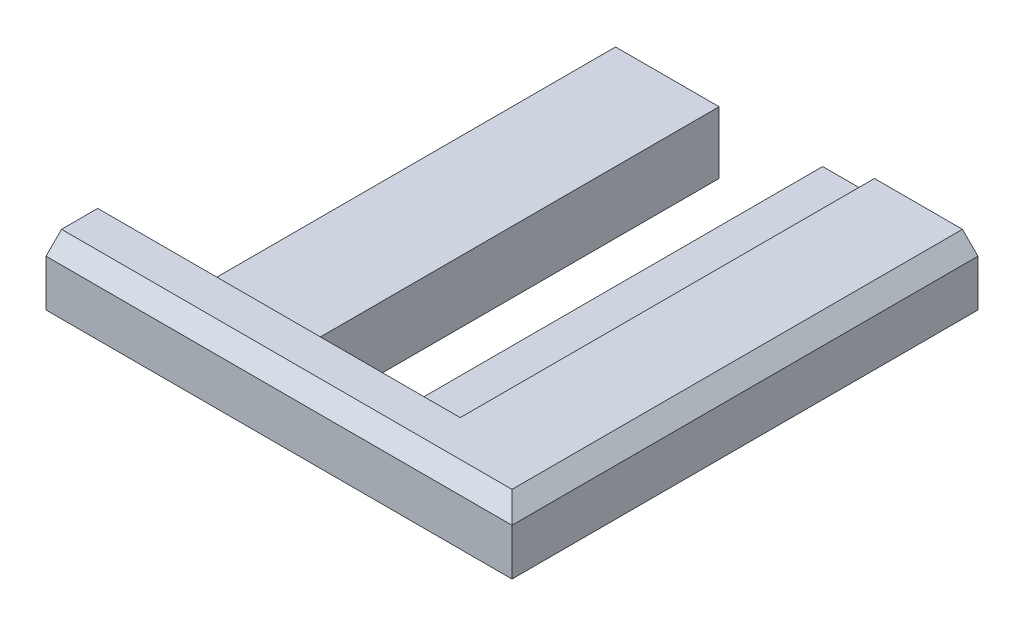
ISO-10303-21;
HEADER;
FILE_DESCRIPTION(('STEP AP214'),'2;1');
FILE_NAME('part.step','',(''),(''),'','','');
FILE_SCHEMA(('AUTOMOTIVE_DESIGN { 1 0 10303 214 1 1 1 1 }'));
ENDSEC;
DATA;
#1=APPLICATION_CONTEXT('core data for automotive mechanical design processes');
#2=APPLICATION_PROTOCOL_DEFINITION('international standard','automotive_design',2000,#1);
#3=PRODUCT_CONTEXT('',#1,'mechanical');
#4=PRODUCT('Part','Part','',(#3));
#5=PRODUCT_RELATED_PRODUCT_CATEGORY('part','',(#4));
#6=PRODUCT_DEFINITION_FORMATION('','',#4);
#7=PRODUCT_DEFINITION_CONTEXT('part definition',#1,'design');
#8=PRODUCT_DEFINITION('design','',#6,#7);
#9=PRODUCT_DEFINITION_SHAPE('','',#8);
#10=(LENGTH_UNIT() NAMED_UNIT(*) SI_UNIT(.MILLI.,.METRE.));
#11=(NAMED_UNIT(*) PLANE_ANGLE_UNIT() SI_UNIT($,.RADIAN.));
#12=(NAMED_UNIT(*) SI_UNIT($,.STERADIAN.) SOLID_ANGLE_UNIT());
#13=UNCERTAINTY_MEASURE_WITH_UNIT(LENGTH_MEASURE(1.E-05),#10,'distance_accuracy_value','');
#14=(GEOMETRIC_REPRESENTATION_CONTEXT(3) GLOBAL_UNCERTAINTY_ASSIGNED_CONTEXT((#13)) GLOBAL_UNIT_ASSIGNED_CONTEXT((#10,
#11,#12)) REPRESENTATION_CONTEXT('',''));
#15=CARTESIAN_POINT('',(0.,0.,0.));
#16=DIRECTION('',(0.,0.,1.));
#17=DIRECTION('',(1.,0.,0.));
#18=AXIS2_PLACEMENT_3D('',#15,#16,#17);
#19=CARTESIAN_POINT('',(0.,38.1,-228.6));
#20=DIRECTION('',(0.,0.,1.));
#21=DIRECTION('',(1.,0.,0.));
#22=AXIS2_PLACEMENT_3D('',#19,#20,#21);
#23=PLANE('',#22);
#24=CARTESIAN_POINT('',(-12.6848921789995,19.05,-228.6));
#25=DIRECTION('',(0.,0.,-1.));
#26=DIRECTION('',(-1.,0.,0.));
#27=AXIS2_PLACEMENT_3D('',#24,#25,#26);
#28=CIRCLE('',#27,9.525);
#29=CARTESIAN_POINT('',(-22.2098921789995,19.05,-228.6));
#30=VERTEX_POINT('',#29);
#31=EDGE_CURVE('E201',#30,#30,#28,.T.);
#32=ORIENTED_EDGE('',*,*,#31,.F.);
#33=EDGE_LOOP('',(#32));
#34=FACE_BOUND('',#33,.T.);
#35=DIRECTION('',(0.,-1.,0.));
#36=VECTOR('',#35,1.);
#37=CARTESIAN_POINT('',(0.,38.1,-228.6));
#38=LINE('',#37,#36);
#39=CARTESIAN_POINT('',(0.,30.48,-228.6));
#40=VERTEX_POINT('',#39);
#41=CARTESIAN_POINT('',(0.,7.62000000000002,-228.6));
#42=VERTEX_POINT('',#41);
#43=EDGE_CURVE('E219',#40,#42,#38,.T.);
#44=ORIENTED_EDGE('',*,*,#43,.T.);
#45=DIRECTION('',(0.707106781186549,0.707106781186546,0.));
#46=VECTOR('',#45,1.);
#47=CARTESIAN_POINT('',(0.,7.61999999999999,-228.6));
#48=LINE('',#47,#46);
#49=CARTESIAN_POINT('',(-7.62000000000004,0.,-228.6));
#50=VERTEX_POINT('',#49);
#51=EDGE_CURVE('E284',#42,#50,#48,.F.);
#52=ORIENTED_EDGE('',*,*,#51,.T.);
#53=DIRECTION('',(-1.,0.,0.));
#54=VECTOR('',#53,1.);
#55=CARTESIAN_POINT('',(0.,0.,-228.6));
#56=LINE('',#55,#54);
#57=CARTESIAN_POINT('',(-76.2,0.,-228.6));
#58=VERTEX_POINT('',#57);
#59=EDGE_CURVE('E211',#50,#58,#56,.T.);
#60=ORIENTED_EDGE('',*,*,#59,.T.);
#61=DIRECTION('',(0.,-1.,0.));
#62=VECTOR('',#61,1.);
#63=CARTESIAN_POINT('',(-76.2,38.1,-228.6));
#64=LINE('',#63,#62);
#65=CARTESIAN_POINT('',(-76.2,30.48,-228.6));
#66=VERTEX_POINT('',#65);
#67=EDGE_CURVE('E259',#66,#58,#64,.T.);
#68=ORIENTED_EDGE('',*,*,#67,.F.);
#69=DIRECTION('',(1.,0.,0.));
#70=VECTOR('',#69,1.);
#71=CARTESIAN_POINT('',(0.,30.48,-228.6));
#72=LINE('',#71,#70);
#73=CARTESIAN_POINT('',(-50.8,30.48,-228.6));
#74=VERTEX_POINT('',#73);
#75=EDGE_CURVE('E199',#66,#74,#72,.T.);
#76=ORIENTED_EDGE('',*,*,#75,.T.);
#77=DIRECTION('',(0.,1.,0.));
#78=VECTOR('',#77,1.);
#79=CARTESIAN_POINT('',(-50.8,38.1,-228.6));
#80=LINE('',#79,#78);
#81=CARTESIAN_POINT('',(-50.8,38.1,-228.6));
#82=VERTEX_POINT('',#81);
#83=EDGE_CURVE('E176',#74,#82,#80,.T.);
#84=ORIENTED_EDGE('',*,*,#83,.T.);
#85=DIRECTION('',(-1.,0.,0.));
#86=VECTOR('',#85,1.);
#87=CARTESIAN_POINT('',(0.,38.1,-228.6));
#88=LINE('',#87,#86);
#89=CARTESIAN_POINT('',(-7.61999999999996,38.1,-228.6));
#90=VERTEX_POINT('',#89);
#91=EDGE_CURVE('E214',#90,#82,#88,.T.);
#92=ORIENTED_EDGE('',*,*,#91,.F.);
#93=DIRECTION('',(0.707106781186545,-0.70710678118655,0.));
#94=VECTOR('',#93,1.);
#95=CARTESIAN_POINT('',(-7.61999999999999,38.1,-228.6));
#96=LINE('',#95,#94);
#97=EDGE_CURVE('E282',#90,#40,#96,.T.);
#98=ORIENTED_EDGE('',*,*,#97,.T.);
#99=EDGE_LOOP('',(#44,#52,#60,#68,#76,#84,#92,#98));
#100=FACE_BOUND('',#99,.T.);
#101=ADVANCED_FACE('F39',(#34,#100),#23,.F.);
#102=CARTESIAN_POINT('',(-76.2,38.1,0.));
#103=DIRECTION('',(-1.,0.,0.));
#104=DIRECTION('',(0.,0.,1.));
#105=AXIS2_PLACEMENT_3D('',#102,#103,#104);
#106=PLANE('',#105);
#107=DIRECTION('',(0.,0.,1.));
#108=VECTOR('',#107,1.);
#109=CARTESIAN_POINT('',(-76.2,30.48,0.));
#110=LINE('',#109,#108);
#111=CARTESIAN_POINT('',(-76.2,30.48,-25.4));
#112=VERTEX_POINT('',#111);
#113=EDGE_CURVE('E197',#66,#112,#110,.T.);
#114=ORIENTED_EDGE('',*,*,#113,.F.);
#115=ORIENTED_EDGE('',*,*,#67,.T.);
#116=DIRECTION('',(0.,0.,-1.));
#117=VECTOR('',#116,1.);
#118=CARTESIAN_POINT('',(-76.2,0.,0.));
#119=LINE('',#118,#117);
#120=CARTESIAN_POINT('',(-76.2,0.,-25.4));
#121=VERTEX_POINT('',#120);
#122=EDGE_CURVE('E221',#121,#58,#119,.T.);
#123=ORIENTED_EDGE('',*,*,#122,.F.);
#124=DIRECTION('',(0.,-1.,0.));
#125=VECTOR('',#124,1.);
#126=CARTESIAN_POINT('',(-76.2,38.1,-25.4));
#127=LINE('',#126,#125);
#128=EDGE_CURVE('E257',#112,#121,#127,.T.);
#129=ORIENTED_EDGE('',*,*,#128,.F.);
#130=EDGE_LOOP('',(#114,#115,#123,#129));
#131=FACE_BOUND('',#130,.T.);
#132=ADVANCED_FACE('F319',(#131),#106,.T.);
#133=CARTESIAN_POINT('',(0.,38.1,-25.4));
#134=DIRECTION('',(0.,0.,1.));
#135=DIRECTION('',(1.,0.,0.));
#136=AXIS2_PLACEMENT_3D('',#133,#134,#135);
#137=PLANE('',#136);
#138=DIRECTION('',(0.,-1.,0.));
#139=VECTOR('',#138,1.);
#140=CARTESIAN_POINT('',(-127.,38.1,-25.4));
#141=LINE('',#140,#139);
#142=CARTESIAN_POINT('',(-127.,30.48,-25.4));
#143=VERTEX_POINT('',#142);
#144=CARTESIAN_POINT('',(-127.,0.,-25.4));
#145=VERTEX_POINT('',#144);
#146=EDGE_CURVE('E255',#143,#145,#141,.T.);
#147=ORIENTED_EDGE('',*,*,#146,.F.);
#148=DIRECTION('',(1.,0.,0.));
#149=VECTOR('',#148,1.);
#150=CARTESIAN_POINT('',(0.,30.48,-25.4));
#151=LINE('',#150,#149);
#152=EDGE_CURVE('E194',#143,#112,#151,.T.);
#153=ORIENTED_EDGE('',*,*,#152,.T.);
#154=ORIENTED_EDGE('',*,*,#128,.T.);
#155=DIRECTION('',(-1.,0.,0.));
#156=VECTOR('',#155,1.);
#157=CARTESIAN_POINT('',(0.,0.,-25.4));
#158=LINE('',#157,#156);
#159=EDGE_CURVE('E224',#121,#145,#158,.T.);
#160=ORIENTED_EDGE('',*,*,#159,.T.);
#161=EDGE_LOOP('',(#147,#153,#154,#160));
#162=FACE_BOUND('',#161,.T.);
#163=ADVANCED_FACE('F322',(#162),#137,.F.);
#164=CARTESIAN_POINT('',(-127.,38.1,0.));
#165=DIRECTION('',(-1.,0.,0.));
#166=DIRECTION('',(0.,0.,1.));
#167=AXIS2_PLACEMENT_3D('',#164,#165,#166);
#168=PLANE('',#167);
#169=DIRECTION('',(0.,-1.,0.));
#170=VECTOR('',#169,1.);
#171=CARTESIAN_POINT('',(-127.,38.1,-228.6));
#172=LINE('',#171,#170);
#173=CARTESIAN_POINT('',(-127.,30.48,-228.6));
#174=VERTEX_POINT('',#173);
#175=CARTESIAN_POINT('',(-127.,0.,-228.6));
#176=VERTEX_POINT('',#175);
#177=EDGE_CURVE('E253',#174,#176,#172,.T.);
#178=ORIENTED_EDGE('',*,*,#177,.F.);
#179=DIRECTION('',(0.,0.,1.));
#180=VECTOR('',#179,1.);
#181=CARTESIAN_POINT('',(-127.,30.48,0.));
#182=LINE('',#181,#180);
#183=EDGE_CURVE('E191',#174,#143,#182,.T.);
#184=ORIENTED_EDGE('',*,*,#183,.T.);
#185=ORIENTED_EDGE('',*,*,#146,.T.);
#186=DIRECTION('',(0.,0.,-1.));
#187=VECTOR('',#186,1.);
#188=CARTESIAN_POINT('',(-127.,0.,0.));
#189=LINE('',#188,#187);
#190=EDGE_CURVE('E227',#145,#176,#189,.T.);
#191=ORIENTED_EDGE('',*,*,#190,.T.);
#192=EDGE_LOOP('',(#178,#184,#185,#191));
#193=FACE_BOUND('',#192,.T.);
#194=ADVANCED_FACE('F325',(#193),#168,.F.);
#195=CARTESIAN_POINT('',(0.,38.1,-228.6));
#196=DIRECTION('',(0.,0.,1.));
#197=DIRECTION('',(1.,0.,0.));
#198=AXIS2_PLACEMENT_3D('',#195,#196,#197);
#199=PLANE('',#198);
#200=DIRECTION('',(0.,-1.,0.));
#201=VECTOR('',#200,1.);
#202=CARTESIAN_POINT('',(-177.8,38.1,-228.6));
#203=LINE('',#202,#201);
#204=CARTESIAN_POINT('',(-177.8,30.48,-228.6));
#205=VERTEX_POINT('',#204);
#206=CARTESIAN_POINT('',(-177.8,0.,-228.6));
#207=VERTEX_POINT('',#206);
#208=EDGE_CURVE('E251',#205,#207,#203,.T.);
#209=ORIENTED_EDGE('',*,*,#208,.F.);
#210=DIRECTION('',(1.,0.,0.));
#211=VECTOR('',#210,1.);
#212=CARTESIAN_POINT('',(0.,30.48,-228.6));
#213=LINE('',#212,#211);
#214=EDGE_CURVE('E188',#205,#174,#213,.T.);
#215=ORIENTED_EDGE('',*,*,#214,.T.);
#216=ORIENTED_EDGE('',*,*,#177,.T.);
#217=DIRECTION('',(-1.,0.,0.));
#218=VECTOR('',#217,1.);
#219=CARTESIAN_POINT('',(0.,0.,-228.6));
#220=LINE('',#219,#218);
#221=EDGE_CURVE('E231',#176,#207,#220,.T.);
#222=ORIENTED_EDGE('',*,*,#221,.T.);
#223=EDGE_LOOP('',(#209,#215,#216,#222));
#224=FACE_BOUND('',#223,.T.);
#225=ADVANCED_FACE('F330',(#224),#199,.F.);
#226=CARTESIAN_POINT('',(-177.8,38.1,0.));
#227=DIRECTION('',(-1.,0.,0.));
#228=DIRECTION('',(0.,0.,1.));
#229=AXIS2_PLACEMENT_3D('',#226,#227,#228);
#230=PLANE('',#229);
#231=DIRECTION('',(0.,0.,1.));
#232=VECTOR('',#231,1.);
#233=CARTESIAN_POINT('',(-177.8,30.48,0.));
#234=LINE('',#233,#232);
#235=CARTESIAN_POINT('',(-177.8,30.48,-25.4));
#236=VERTEX_POINT('',#235);
#237=EDGE_CURVE('E186',#205,#236,#234,.T.);
#238=ORIENTED_EDGE('',*,*,#237,.F.);
#239=ORIENTED_EDGE('',*,*,#208,.T.);
#240=DIRECTION('',(0.,0.,-1.));
#241=VECTOR('',#240,1.);
#242=CARTESIAN_POINT('',(-177.8,0.,0.));
#243=LINE('',#242,#241);
#244=CARTESIAN_POINT('',(-177.8,0.,-25.4));
#245=VERTEX_POINT('',#244);
#246=EDGE_CURVE('E234',#245,#207,#243,.T.);
#247=ORIENTED_EDGE('',*,*,#246,.F.);
#248=DIRECTION('',(0.,-1.,0.));
#249=VECTOR('',#248,1.);
#250=CARTESIAN_POINT('',(-177.8,38.1,-25.4));
#251=LINE('',#250,#249);
#252=EDGE_CURVE('E249',#236,#245,#251,.T.);
#253=ORIENTED_EDGE('',*,*,#252,.F.);
#254=EDGE_LOOP('',(#238,#239,#247,#253));
#255=FACE_BOUND('',#254,.T.);
#256=ADVANCED_FACE('F333',(#255),#230,.T.);
#257=DIRECTION('',(0.,-1.,0.));
#258=VECTOR('',#257,1.);
#259=CARTESIAN_POINT('',(-228.6,38.1,-25.4));
#260=LINE('',#259,#258);
#261=CARTESIAN_POINT('',(-228.6,30.48,-25.4));
#262=VERTEX_POINT('',#261);
#263=CARTESIAN_POINT('',(-228.6,0.,-25.4));
#264=VERTEX_POINT('',#263);
#265=EDGE_CURVE('E246',#262,#264,#260,.T.);
#266=ORIENTED_EDGE('',*,*,#265,.F.);
#267=DIRECTION('',(1.,0.,0.));
#268=VECTOR('',#267,1.);
#269=CARTESIAN_POINT('',(0.,30.48,-25.4));
#270=LINE('',#269,#268);
#271=EDGE_CURVE('E183',#262,#236,#270,.T.);
#272=ORIENTED_EDGE('',*,*,#271,.T.);
#273=ORIENTED_EDGE('',*,*,#252,.T.);
#274=EDGE_CURVE('E228',#245,#264,#158,.T.);
#275=ORIENTED_EDGE('',*,*,#274,.T.);
#276=EDGE_LOOP('',(#266,#272,#273,#275));
#277=FACE_BOUND('',#276,.T.);
#278=ADVANCED_FACE('F337',(#277),#137,.F.);
#279=CARTESIAN_POINT('',(-228.6,38.1,0.));
#280=DIRECTION('',(-1.,0.,0.));
#281=DIRECTION('',(0.,0.,1.));
#282=AXIS2_PLACEMENT_3D('',#279,#280,#281);
#283=PLANE('',#282);
#284=DIRECTION('',(0.,0.,-1.));
#285=VECTOR('',#284,1.);
#286=CARTESIAN_POINT('',(-228.6,0.,0.));
#287=LINE('',#286,#285);
#288=CARTESIAN_POINT('',(-228.6,0.,-7.62000000000004));
#289=VERTEX_POINT('',#288);
#290=EDGE_CURVE('E217',#289,#264,#287,.T.);
#291=ORIENTED_EDGE('',*,*,#290,.F.);
#292=DIRECTION('',(0.,0.707106781186546,0.707106781186549));
#293=VECTOR('',#292,1.);
#294=CARTESIAN_POINT('',(-228.6,22.86,15.24));
#295=LINE('',#294,#293);
#296=CARTESIAN_POINT('',(-228.6,7.62000000000002,0.));
#297=VERTEX_POINT('',#296);
#298=EDGE_CURVE('E271',#289,#297,#295,.T.);
#299=ORIENTED_EDGE('',*,*,#298,.T.);
#300=DIRECTION('',(0.,-1.,0.));
#301=VECTOR('',#300,1.);
#302=CARTESIAN_POINT('',(-228.6,38.1,0.));
#303=LINE('',#302,#301);
#304=CARTESIAN_POINT('',(-228.6,30.48,0.));
#305=VERTEX_POINT('',#304);
#306=EDGE_CURVE('E243',#305,#297,#303,.T.);
#307=ORIENTED_EDGE('',*,*,#306,.F.);
#308=DIRECTION('',(0.,-0.70710678118655,0.707106781186545));
#309=VECTOR('',#308,1.);
#310=CARTESIAN_POINT('',(-228.6,34.29,-3.81000000000001));
#311=LINE('',#310,#309);
#312=CARTESIAN_POINT('',(-228.6,38.1,-7.61999999999996));
#313=VERTEX_POINT('',#312);
#314=EDGE_CURVE('E269',#305,#313,#311,.F.);
#315=ORIENTED_EDGE('',*,*,#314,.T.);
#316=DIRECTION('',(0.,0.,-1.));
#317=VECTOR('',#316,1.);
#318=CARTESIAN_POINT('',(-228.6,38.1,0.));
#319=LINE('',#318,#317);
#320=CARTESIAN_POINT('',(-228.6,38.1,-25.3774669977022));
#321=VERTEX_POINT('',#320);
#322=EDGE_CURVE('E216',#313,#321,#319,.T.);
#323=ORIENTED_EDGE('',*,*,#322,.T.);
#324=DIRECTION('',(0.,1.,0.));
#325=VECTOR('',#324,1.);
#326=CARTESIAN_POINT('',(-228.6,38.1,-25.3774669977022));
#327=LINE('',#326,#325);
#328=CARTESIAN_POINT('',(-228.6,30.48,-25.3774669977022));
#329=VERTEX_POINT('',#328);
#330=EDGE_CURVE('E172',#329,#321,#327,.T.);
#331=ORIENTED_EDGE('',*,*,#330,.F.);
#332=DIRECTION('',(0.,0.,1.));
#333=VECTOR('',#332,1.);
#334=CARTESIAN_POINT('',(-228.6,30.48,0.));
#335=LINE('',#334,#333);
#336=EDGE_CURVE('E158',#262,#329,#335,.T.);
#337=ORIENTED_EDGE('',*,*,#336,.F.);
#338=ORIENTED_EDGE('',*,*,#265,.T.);
#339=EDGE_LOOP('',(#291,#299,#307,#315,#323,#331,#337,#338));
#340=FACE_BOUND('',#339,.T.);
#341=CARTESIAN_POINT('',(-228.6,19.05,-12.7));
#342=DIRECTION('',(-1.,0.,0.));
#343=DIRECTION('',(0.,0.,1.));
#344=AXIS2_PLACEMENT_3D('',#341,#342,#343);
#345=CIRCLE('',#344,9.525);
#346=CARTESIAN_POINT('',(-228.6,19.05,-3.175));
#347=VERTEX_POINT('',#346);
#348=EDGE_CURVE('E205',#347,#347,#345,.T.);
#349=ORIENTED_EDGE('',*,*,#348,.F.);
#350=EDGE_LOOP('',(#349));
#351=FACE_BOUND('',#350,.T.);
#352=ADVANCED_FACE('F342',(#340,#351),#283,.T.);
#353=CARTESIAN_POINT('',(0.,38.1,0.));
#354=DIRECTION('',(0.,0.,1.));
#355=DIRECTION('',(1.,0.,0.));
#356=AXIS2_PLACEMENT_3D('',#353,#354,#355);
#357=PLANE('',#356);
#358=ORIENTED_EDGE('',*,*,#306,.T.);
#359=DIRECTION('',(1.,0.,0.));
#360=VECTOR('',#359,1.);
#361=CARTESIAN_POINT('',(0.,7.62000000000002,0.));
#362=LINE('',#361,#360);
#363=CARTESIAN_POINT('',(0.,7.62000000000002,0.));
#364=VERTEX_POINT('',#363);
#365=EDGE_CURVE('E276',#297,#364,#362,.T.);
#366=ORIENTED_EDGE('',*,*,#365,.T.);
#367=DIRECTION('',(0.,-1.,0.));
#368=VECTOR('',#367,1.);
#369=CARTESIAN_POINT('',(0.,38.1,0.));
#370=LINE('',#369,#368);
#371=CARTESIAN_POINT('',(0.,30.48,0.));
#372=VERTEX_POINT('',#371);
#373=EDGE_CURVE('E240',#372,#364,#370,.T.);
#374=ORIENTED_EDGE('',*,*,#373,.F.);
#375=DIRECTION('',(-1.,0.,0.));
#376=VECTOR('',#375,1.);
#377=CARTESIAN_POINT('',(0.,30.48,0.));
#378=LINE('',#377,#376);
#379=EDGE_CURVE('E273',#372,#305,#378,.T.);
#380=ORIENTED_EDGE('',*,*,#379,.T.);
#381=EDGE_LOOP('',(#358,#366,#374,#380));
#382=FACE_BOUND('',#381,.T.);
#383=ADVANCED_FACE('F353',(#382),#357,.T.);
#384=CARTESIAN_POINT('',(0.,38.1,0.));
#385=DIRECTION('',(-1.,0.,0.));
#386=DIRECTION('',(0.,0.,1.));
#387=AXIS2_PLACEMENT_3D('',#384,#385,#386);
#388=PLANE('',#387);
#389=ORIENTED_EDGE('',*,*,#373,.T.);
#390=DIRECTION('',(0.,0.,-1.));
#391=VECTOR('',#390,1.);
#392=CARTESIAN_POINT('',(0.,7.62000000000002,0.));
#393=LINE('',#392,#391);
#394=EDGE_CURVE('E280',#364,#42,#393,.T.);
#395=ORIENTED_EDGE('',*,*,#394,.T.);
#396=ORIENTED_EDGE('',*,*,#43,.F.);
#397=DIRECTION('',(0.,0.,1.));
#398=VECTOR('',#397,1.);
#399=CARTESIAN_POINT('',(0.,30.48,0.));
#400=LINE('',#399,#398);
#401=EDGE_CURVE('E278',#40,#372,#400,.T.);
#402=ORIENTED_EDGE('',*,*,#401,.T.);
#403=EDGE_LOOP('',(#389,#395,#396,#402));
#404=FACE_BOUND('',#403,.T.);
#405=ADVANCED_FACE('F303',(#404),#388,.F.);
#406=CARTESIAN_POINT('',(0.,38.1,0.));
#407=DIRECTION('',(0.,1.,0.));
#408=DIRECTION('',(0.,0.,1.));
#409=AXIS2_PLACEMENT_3D('',#406,#407,#408);
#410=PLANE('',#409);
#411=ORIENTED_EDGE('',*,*,#322,.F.);
#412=DIRECTION('',(1.,0.,0.));
#413=VECTOR('',#412,1.);
#414=CARTESIAN_POINT('',(0.,38.1,-7.61999999999996));
#415=LINE('',#414,#413);
#416=CARTESIAN_POINT('',(-7.61999999999996,38.1,-7.61999999999996));
#417=VERTEX_POINT('',#416);
#418=EDGE_CURVE('E11',#313,#417,#415,.T.);
#419=ORIENTED_EDGE('',*,*,#418,.T.);
#420=DIRECTION('',(0.,0.,-1.));
#421=VECTOR('',#420,1.);
#422=CARTESIAN_POINT('',(-7.61999999999996,38.1,-228.6));
#423=LINE('',#422,#421);
#424=EDGE_CURVE('E49',#417,#90,#423,.T.);
#425=ORIENTED_EDGE('',*,*,#424,.T.);
#426=ORIENTED_EDGE('',*,*,#91,.T.);
#427=DIRECTION('',(0.,0.,-1.));
#428=VECTOR('',#427,1.);
#429=CARTESIAN_POINT('',(-50.8,38.1,-25.4));
#430=LINE('',#429,#428);
#431=CARTESIAN_POINT('',(-50.8,38.1,-25.4));
#432=VERTEX_POINT('',#431);
#433=EDGE_CURVE('E162',#432,#82,#430,.T.);
#434=ORIENTED_EDGE('',*,*,#433,.F.);
#435=DIRECTION('',(0.999999991969463,0.,-0.000126732295370555));
#436=VECTOR('',#435,1.);
#437=CARTESIAN_POINT('',(-0.00321981617915604,38.1,-25.4064375926018));
#438=LINE('',#437,#436);
#439=EDGE_CURVE('E168',#321,#432,#438,.T.);
#440=ORIENTED_EDGE('',*,*,#439,.F.);
#441=EDGE_LOOP('',(#411,#419,#425,#426,#434,#440));
#442=FACE_BOUND('',#441,.T.);
#443=ADVANCED_FACE('F344',(#442),#410,.T.);
#444=CARTESIAN_POINT('',(0.,0.,0.));
#445=DIRECTION('',(0.,1.,0.));
#446=DIRECTION('',(0.,0.,1.));
#447=AXIS2_PLACEMENT_3D('',#444,#445,#446);
#448=PLANE('',#447);
#449=DIRECTION('',(0.,0.,1.));
#450=VECTOR('',#449,1.);
#451=CARTESIAN_POINT('',(-7.62000000000004,0.,0.));
#452=LINE('',#451,#450);
#453=CARTESIAN_POINT('',(-7.62000000000004,0.,-7.62000000000004));
#454=VERTEX_POINT('',#453);
#455=EDGE_CURVE('E264',#50,#454,#452,.T.);
#456=ORIENTED_EDGE('',*,*,#455,.T.);
#457=DIRECTION('',(-1.,0.,0.));
#458=VECTOR('',#457,1.);
#459=CARTESIAN_POINT('',(-228.6,0.,-7.62000000000004));
#460=LINE('',#459,#458);
#461=EDGE_CURVE('E266',#454,#289,#460,.T.);
#462=ORIENTED_EDGE('',*,*,#461,.T.);
#463=ORIENTED_EDGE('',*,*,#290,.T.);
#464=ORIENTED_EDGE('',*,*,#274,.F.);
#465=ORIENTED_EDGE('',*,*,#246,.T.);
#466=ORIENTED_EDGE('',*,*,#221,.F.);
#467=ORIENTED_EDGE('',*,*,#190,.F.);
#468=ORIENTED_EDGE('',*,*,#159,.F.);
#469=ORIENTED_EDGE('',*,*,#122,.T.);
#470=ORIENTED_EDGE('',*,*,#59,.F.);
#471=EDGE_LOOP('',(#456,#462,#463,#464,#465,#466,#467,#468,#469,#470));
#472=FACE_BOUND('',#471,.T.);
#473=ADVANCED_FACE('F312',(#472),#448,.F.);
#474=CARTESIAN_POINT('',(-190.5,19.05,-12.7));
#475=DIRECTION('',(-1.,0.,0.));
#476=DIRECTION('',(0.,0.,1.));
#477=AXIS2_PLACEMENT_3D('',#474,#475,#476);
#478=CYLINDRICAL_SURFACE('',#477,9.525);
#479=CARTESIAN_POINT('',(-190.5,19.05,-12.7));
#480=DIRECTION('',(-1.,0.,0.));
#481=DIRECTION('',(0.,0.,1.));
#482=AXIS2_PLACEMENT_3D('',#479,#480,#481);
#483=CIRCLE('',#482,9.525);
#484=CARTESIAN_POINT('',(-190.5,19.05,-3.175));
#485=VERTEX_POINT('',#484);
#486=EDGE_CURVE('E208',#485,#485,#483,.T.);
#487=CARTESIAN_POINT('',(-190.5,19.05,-3.175));
#488=CARTESIAN_POINT('',(-190.896875,19.05,-3.175));
#489=CARTESIAN_POINT('',(-191.29375,19.05,-3.175));
#490=CARTESIAN_POINT('',(-192.0875,19.05,-3.175));
#491=CARTESIAN_POINT('',(-192.484375,19.05,-3.175));
#492=CARTESIAN_POINT('',(-193.278125,19.05,-3.175));
#493=CARTESIAN_POINT('',(-193.675,19.05,-3.175));
#494=CARTESIAN_POINT('',(-194.46875,19.05,-3.175));
#495=CARTESIAN_POINT('',(-194.865625,19.05,-3.175));
#496=CARTESIAN_POINT('',(-195.659375,19.05,-3.175));
#497=CARTESIAN_POINT('',(-196.05625,19.05,-3.175));
#498=CARTESIAN_POINT('',(-196.85,19.05,-3.175));
#499=CARTESIAN_POINT('',(-197.246875,19.05,-3.175));
#500=CARTESIAN_POINT('',(-198.040625,19.05,-3.175));
#501=CARTESIAN_POINT('',(-198.4375,19.05,-3.175));
#502=CARTESIAN_POINT('',(-199.23125,19.05,-3.175));
#503=CARTESIAN_POINT('',(-199.628125,19.05,-3.175));
#504=CARTESIAN_POINT('',(-200.421875,19.05,-3.175));
#505=CARTESIAN_POINT('',(-200.81875,19.05,-3.175));
#506=CARTESIAN_POINT('',(-201.6125,19.05,-3.175));
#507=CARTESIAN_POINT('',(-202.009375,19.05,-3.175));
#508=CARTESIAN_POINT('',(-202.803125,19.05,-3.175));
#509=CARTESIAN_POINT('',(-203.2,19.05,-3.175));
#510=CARTESIAN_POINT('',(-203.99375,19.05,-3.175));
#511=CARTESIAN_POINT('',(-204.390625,19.05,-3.175));
#512=CARTESIAN_POINT('',(-205.184375,19.05,-3.175));
#513=CARTESIAN_POINT('',(-205.58125,19.05,-3.175));
#514=CARTESIAN_POINT('',(-206.375,19.05,-3.175));
#515=CARTESIAN_POINT('',(-206.771875,19.05,-3.175));
#516=CARTESIAN_POINT('',(-207.565625,19.05,-3.175));
#517=CARTESIAN_POINT('',(-207.9625,19.05,-3.175));
#518=CARTESIAN_POINT('',(-208.75625,19.05,-3.175));
#519=CARTESIAN_POINT('',(-209.153125,19.05,-3.175));
#520=CARTESIAN_POINT('',(-209.946875,19.05,-3.175));
#521=CARTESIAN_POINT('',(-210.34375,19.05,-3.175));
#522=CARTESIAN_POINT('',(-211.1375,19.05,-3.175));
#523=CARTESIAN_POINT('',(-211.534375,19.05,-3.175));
#524=CARTESIAN_POINT('',(-212.328125,19.05,-3.175));
#525=CARTESIAN_POINT('',(-212.725,19.05,-3.175));
#526=CARTESIAN_POINT('',(-213.51875,19.05,-3.175));
#527=CARTESIAN_POINT('',(-213.915625,19.05,-3.175));
#528=CARTESIAN_POINT('',(-214.709375,19.05,-3.175));
#529=CARTESIAN_POINT('',(-215.10625,19.05,-3.175));
#530=CARTESIAN_POINT('',(-215.9,19.05,-3.175));
#531=CARTESIAN_POINT('',(-216.296875,19.05,-3.175));
#532=CARTESIAN_POINT('',(-217.090625,19.05,-3.175));
#533=CARTESIAN_POINT('',(-217.4875,19.05,-3.175));
#534=CARTESIAN_POINT('',(-218.28125,19.05,-3.175));
#535=CARTESIAN_POINT('',(-218.678125,19.05,-3.175));
#536=CARTESIAN_POINT('',(-219.471875,19.05,-3.175));
#537=CARTESIAN_POINT('',(-219.86875,19.05,-3.175));
#538=CARTESIAN_POINT('',(-220.6625,19.05,-3.175));
#539=CARTESIAN_POINT('',(-221.059375,19.05,-3.175));
#540=CARTESIAN_POINT('',(-221.853125,19.05,-3.175));
#541=CARTESIAN_POINT('',(-222.25,19.05,-3.175));
#542=CARTESIAN_POINT('',(-223.04375,19.05,-3.175));
#543=CARTESIAN_POINT('',(-223.440625,19.05,-3.175));
#544=CARTESIAN_POINT('',(-224.234375,19.05,-3.175));
#545=CARTESIAN_POINT('',(-224.63125,19.05,-3.175));
#546=CARTESIAN_POINT('',(-225.425,19.05,-3.175));
#547=CARTESIAN_POINT('',(-225.821875,19.05,-3.175));
#548=CARTESIAN_POINT('',(-226.615625,19.05,-3.175));
#549=CARTESIAN_POINT('',(-227.0125,19.05,-3.175));
#550=CARTESIAN_POINT('',(-227.80625,19.05,-3.175));
#551=CARTESIAN_POINT('',(-228.203125,19.05,-3.175));
#552=CARTESIAN_POINT('',(-228.6,19.05,-3.175));
#553=B_SPLINE_CURVE_WITH_KNOTS('',3,(#487,#488,#489,#490,#491,#492,#493,#494,#495,#496,#497,
#498,#499,#500,#501,#502,#503,#504,#505,#506,#507,#508,#509,#510,#511,#512,#513,#514,#515,#516,
#517,#518,#519,#520,#521,#522,#523,#524,#525,#526,#527,#528,#529,#530,#531,#532,#533,#534,#535,
#536,#537,#538,#539,#540,#541,#542,#543,#544,#545,#546,#547,#548,#549,#550,#551,#552),
.UNSPECIFIED.,.F.,.F.,(4,2,2,2,2,2,2,2,2,2,2,2,2,2,2,2,2,2,2,2,2,2,2,2,2,2,2,2,2,2,2,2,4),(0.,
1.190625,2.38125,3.571875,4.7625,5.953125,7.14375,8.334375,9.52500000000001,10.715625,11.90625,
13.096875,14.2875,15.478125,16.66875,17.859375,19.05,20.240625,21.43125,22.621875,23.8125,
25.003125,26.19375,27.384375,28.575,29.765625,30.95625,32.146875,33.3375,34.528125,35.71875,
36.909375,38.1),.UNSPECIFIED.);
#554=EDGE_CURVE('BSEAM351',#485,#347,#553,.T.);
#555=ORIENTED_EDGE('',*,*,#486,.F.);
#556=ORIENTED_EDGE('',*,*,#348,.T.);
#557=ORIENTED_EDGE('',*,*,#554,.T.);
#558=ORIENTED_EDGE('',*,*,#554,.F.);
#559=EDGE_LOOP('',(#555,#557,#556,#558));
#560=FACE_BOUND('',#559,.T.);
#561=ADVANCED_FACE('F351',(#560),#478,.F.);
#562=CARTESIAN_POINT('',(-190.5,19.05,-12.7));
#563=DIRECTION('',(-1.,0.,0.));
#564=DIRECTION('',(0.,0.,1.));
#565=AXIS2_PLACEMENT_3D('',#562,#563,#564);
#566=PLANE('',#565);
#567=ORIENTED_EDGE('',*,*,#486,.T.);
#568=EDGE_LOOP('',(#567));
#569=FACE_BOUND('',#568,.T.);
#570=ADVANCED_FACE('F428',(#569),#566,.T.);
#571=CARTESIAN_POINT('',(-12.6848921789995,19.05,-190.5));
#572=DIRECTION('',(0.,0.,-1.));
#573=DIRECTION('',(-1.,0.,0.));
#574=AXIS2_PLACEMENT_3D('',#571,#572,#573);
#575=CYLINDRICAL_SURFACE('',#574,9.525);
#576=CARTESIAN_POINT('',(-12.6848921789995,19.05,-190.5));
#577=DIRECTION('',(0.,0.,-1.));
#578=DIRECTION('',(-1.,0.,0.));
#579=AXIS2_PLACEMENT_3D('',#576,#577,#578);
#580=CIRCLE('',#579,9.525);
#581=CARTESIAN_POINT('',(-22.2098921789995,19.05,-190.5));
#582=VERTEX_POINT('',#581);
#583=EDGE_CURVE('E202',#582,#582,#580,.T.);
#584=CARTESIAN_POINT('',(-22.2098921789995,19.05,-190.5));
#585=CARTESIAN_POINT('',(-22.2098921789995,19.05,-190.896875));
#586=CARTESIAN_POINT('',(-22.2098921789995,19.05,-191.29375));
#587=CARTESIAN_POINT('',(-22.2098921789995,19.05,-192.0875));
#588=CARTESIAN_POINT('',(-22.2098921789995,19.05,-192.484375));
#589=CARTESIAN_POINT('',(-22.2098921789995,19.05,-193.278125));
#590=CARTESIAN_POINT('',(-22.2098921789995,19.05,-193.675));
#591=CARTESIAN_POINT('',(-22.2098921789995,19.05,-194.46875));
#592=CARTESIAN_POINT('',(-22.2098921789995,19.05,-194.865625));
#593=CARTESIAN_POINT('',(-22.2098921789995,19.05,-195.659375));
#594=CARTESIAN_POINT('',(-22.2098921789995,19.05,-196.05625));
#595=CARTESIAN_POINT('',(-22.2098921789995,19.05,-196.85));
#596=CARTESIAN_POINT('',(-22.2098921789995,19.05,-197.246875));
#597=CARTESIAN_POINT('',(-22.2098921789995,19.05,-198.040625));
#598=CARTESIAN_POINT('',(-22.2098921789995,19.05,-198.4375));
#599=CARTESIAN_POINT('',(-22.2098921789995,19.05,-199.23125));
#600=CARTESIAN_POINT('',(-22.2098921789995,19.05,-199.628125));
#601=CARTESIAN_POINT('',(-22.2098921789995,19.05,-200.421875));
#602=CARTESIAN_POINT('',(-22.2098921789995,19.05,-200.81875));
#603=CARTESIAN_POINT('',(-22.2098921789995,19.05,-201.6125));
#604=CARTESIAN_POINT('',(-22.2098921789995,19.05,-202.009375));
#605=CARTESIAN_POINT('',(-22.2098921789995,19.05,-202.803125));
#606=CARTESIAN_POINT('',(-22.2098921789995,19.05,-203.2));
#607=CARTESIAN_POINT('',(-22.2098921789995,19.05,-203.99375));
#608=CARTESIAN_POINT('',(-22.2098921789995,19.05,-204.390625));
#609=CARTESIAN_POINT('',(-22.2098921789995,19.05,-205.184375));
#610=CARTESIAN_POINT('',(-22.2098921789995,19.05,-205.58125));
#611=CARTESIAN_POINT('',(-22.2098921789995,19.05,-206.375));
#612=CARTESIAN_POINT('',(-22.2098921789995,19.05,-206.771875));
#613=CARTESIAN_POINT('',(-22.2098921789995,19.05,-207.565625));
#614=CARTESIAN_POINT('',(-22.2098921789995,19.05,-207.9625));
#615=CARTESIAN_POINT('',(-22.2098921789995,19.05,-208.75625));
#616=CARTESIAN_POINT('',(-22.2098921789995,19.05,-209.153125));
#617=CARTESIAN_POINT('',(-22.2098921789995,19.05,-209.946875));
#618=CARTESIAN_POINT('',(-22.2098921789995,19.05,-210.34375));
#619=CARTESIAN_POINT('',(-22.2098921789995,19.05,-211.1375));
#620=CARTESIAN_POINT('',(-22.2098921789995,19.05,-211.534375));
#621=CARTESIAN_POINT('',(-22.2098921789995,19.05,-212.328125));
#622=CARTESIAN_POINT('',(-22.2098921789995,19.05,-212.725));
#623=CARTESIAN_POINT('',(-22.2098921789995,19.05,-213.51875));
#624=CARTESIAN_POINT('',(-22.2098921789995,19.05,-213.915625));
#625=CARTESIAN_POINT('',(-22.2098921789995,19.05,-214.709375));
#626=CARTESIAN_POINT('',(-22.2098921789995,19.05,-215.10625));
#627=CARTESIAN_POINT('',(-22.2098921789995,19.05,-215.9));
#628=CARTESIAN_POINT('',(-22.2098921789995,19.05,-216.296875));
#629=CARTESIAN_POINT('',(-22.2098921789995,19.05,-217.090625));
#630=CARTESIAN_POINT('',(-22.2098921789995,19.05,-217.4875));
#631=CARTESIAN_POINT('',(-22.2098921789995,19.05,-218.28125));
#632=CARTESIAN_POINT('',(-22.2098921789995,19.05,-218.678125));
#633=CARTESIAN_POINT('',(-22.2098921789995,19.05,-219.471875));
#634=CARTESIAN_POINT('',(-22.2098921789995,19.05,-219.86875));
#635=CARTESIAN_POINT('',(-22.2098921789995,19.05,-220.6625));
#636=CARTESIAN_POINT('',(-22.2098921789995,19.05,-221.059375));
#637=CARTESIAN_POINT('',(-22.2098921789995,19.05,-221.853125));
#638=CARTESIAN_POINT('',(-22.2098921789995,19.05,-222.25));
#639=CARTESIAN_POINT('',(-22.2098921789995,19.05,-223.04375));
#640=CARTESIAN_POINT('',(-22.2098921789995,19.05,-223.440625));
#641=CARTESIAN_POINT('',(-22.2098921789995,19.05,-224.234375));
#642=CARTESIAN_POINT('',(-22.2098921789995,19.05,-224.63125));
#643=CARTESIAN_POINT('',(-22.2098921789995,19.05,-225.425));
#644=CARTESIAN_POINT('',(-22.2098921789995,19.05,-225.821875));
#645=CARTESIAN_POINT('',(-22.2098921789995,19.05,-226.615625));
#646=CARTESIAN_POINT('',(-22.2098921789995,19.05,-227.0125));
#647=CARTESIAN_POINT('',(-22.2098921789995,19.05,-227.80625));
#648=CARTESIAN_POINT('',(-22.2098921789995,19.05,-228.203125));
#649=CARTESIAN_POINT('',(-22.2098921789995,19.05,-228.6));
#650=B_SPLINE_CURVE_WITH_KNOTS('',3,(#584,#585,#586,#587,#588,#589,#590,#591,#592,#593,#594,
#595,#596,#597,#598,#599,#600,#601,#602,#603,#604,#605,#606,#607,#608,#609,#610,#611,#612,#613,
#614,#615,#616,#617,#618,#619,#620,#621,#622,#623,#624,#625,#626,#627,#628,#629,#630,#631,#632,
#633,#634,#635,#636,#637,#638,#639,#640,#641,#642,#643,#644,#645,#646,#647,#648,#649),
.UNSPECIFIED.,.F.,.F.,(4,2,2,2,2,2,2,2,2,2,2,2,2,2,2,2,2,2,2,2,2,2,2,2,2,2,2,2,2,2,2,2,4),(0.,
1.190625,2.38125,3.571875,4.7625,5.953125,7.14375,8.334375,9.52500000000001,10.715625,11.90625,
13.096875,14.2875,15.478125,16.66875,17.859375,19.05,20.240625,21.43125,22.621875,23.8125,
25.003125,26.19375,27.384375,28.575,29.765625,30.95625,32.146875,33.3375,34.528125,35.71875,
36.909375,38.1),.UNSPECIFIED.);
#651=EDGE_CURVE('BSEAM419',#582,#30,#650,.T.);
#652=ORIENTED_EDGE('',*,*,#583,.F.);
#653=ORIENTED_EDGE('',*,*,#31,.T.);
#654=ORIENTED_EDGE('',*,*,#651,.T.);
#655=ORIENTED_EDGE('',*,*,#651,.F.);
#656=EDGE_LOOP('',(#652,#654,#653,#655));
#657=FACE_BOUND('',#656,.T.);
#658=ADVANCED_FACE('F419',(#657),#575,.F.);
#659=CARTESIAN_POINT('',(-12.6848921789995,19.05,-190.5));
#660=DIRECTION('',(0.,0.,-1.));
#661=DIRECTION('',(-1.,0.,0.));
#662=AXIS2_PLACEMENT_3D('',#659,#660,#661);
#663=PLANE('',#662);
#664=ORIENTED_EDGE('',*,*,#583,.T.);
#665=EDGE_LOOP('',(#664));
#666=FACE_BOUND('',#665,.T.);
#667=ADVANCED_FACE('F413',(#666),#663,.T.);
#668=CARTESIAN_POINT('',(0.,30.48,0.));
#669=DIRECTION('',(0.,-1.,0.));
#670=DIRECTION('',(0.,0.,-1.));
#671=AXIS2_PLACEMENT_3D('',#668,#669,#670);
#672=PLANE('',#671);
#673=ORIENTED_EDGE('',*,*,#113,.T.);
#674=ORIENTED_EDGE('',*,*,#152,.F.);
#675=ORIENTED_EDGE('',*,*,#183,.F.);
#676=ORIENTED_EDGE('',*,*,#214,.F.);
#677=ORIENTED_EDGE('',*,*,#237,.T.);
#678=ORIENTED_EDGE('',*,*,#271,.F.);
#679=ORIENTED_EDGE('',*,*,#336,.T.);
#680=DIRECTION('',(0.999999991969463,0.,-0.000126732295370555));
#681=VECTOR('',#680,1.);
#682=CARTESIAN_POINT('',(-50.8,30.48,-25.4));
#683=LINE('',#682,#681);
#684=CARTESIAN_POINT('',(-50.8,30.48,-25.4));
#685=VERTEX_POINT('',#684);
#686=EDGE_CURVE('E151',#329,#685,#683,.T.);
#687=ORIENTED_EDGE('',*,*,#686,.T.);
#688=DIRECTION('',(0.,0.,-1.));
#689=VECTOR('',#688,1.);
#690=CARTESIAN_POINT('',(-50.8,30.48,-25.4));
#691=LINE('',#690,#689);
#692=EDGE_CURVE('E155',#685,#74,#691,.T.);
#693=ORIENTED_EDGE('',*,*,#692,.T.);
#694=ORIENTED_EDGE('',*,*,#75,.F.);
#695=EDGE_LOOP('',(#673,#674,#675,#676,#677,#678,#679,#687,#693,#694));
#696=FACE_BOUND('',#695,.T.);
#697=ADVANCED_FACE('F153',(#696),#672,.F.);
#698=CARTESIAN_POINT('',(-50.8,30.48,-25.4));
#699=DIRECTION('',(1.,0.,0.));
#700=DIRECTION('',(0.,0.,-1.));
#701=AXIS2_PLACEMENT_3D('',#698,#699,#700);
#702=PLANE('',#701);
#703=ORIENTED_EDGE('',*,*,#692,.F.);
#704=DIRECTION('',(0.,1.,0.));
#705=VECTOR('',#704,1.);
#706=CARTESIAN_POINT('',(-50.8,30.48,-25.4));
#707=LINE('',#706,#705);
#708=EDGE_CURVE('E165',#685,#432,#707,.T.);
#709=ORIENTED_EDGE('',*,*,#708,.T.);
#710=ORIENTED_EDGE('',*,*,#433,.T.);
#711=ORIENTED_EDGE('',*,*,#83,.F.);
#712=EDGE_LOOP('',(#703,#709,#710,#711));
#713=FACE_BOUND('',#712,.T.);
#714=ADVANCED_FACE('F174',(#713),#702,.F.);
#715=CARTESIAN_POINT('',(-50.8,30.48,-25.4));
#716=DIRECTION('',(0.000126732295370555,0.,0.999999991969463));
#717=DIRECTION('',(0.999999991969463,0.,-0.000126732295370555));
#718=AXIS2_PLACEMENT_3D('',#715,#716,#717);
#719=PLANE('',#718);
#720=ORIENTED_EDGE('',*,*,#330,.T.);
#721=ORIENTED_EDGE('',*,*,#439,.T.);
#722=ORIENTED_EDGE('',*,*,#708,.F.);
#723=ORIENTED_EDGE('',*,*,#686,.F.);
#724=EDGE_LOOP('',(#720,#721,#722,#723));
#725=FACE_BOUND('',#724,.T.);
#726=ADVANCED_FACE('F166',(#725),#719,.F.);
#727=CARTESIAN_POINT('',(0.,7.62000000000002,0.));
#728=DIRECTION('',(-0.707106781186546,0.707106781186549,0.));
#729=DIRECTION('',(0.,0.,-1.));
#730=AXIS2_PLACEMENT_3D('',#727,#728,#729);
#731=PLANE('',#730);
#732=ORIENTED_EDGE('',*,*,#51,.F.);
#733=ORIENTED_EDGE('',*,*,#394,.F.);
#734=DIRECTION('',(0.577350269189626,0.577350269189625,0.577350269189626));
#735=VECTOR('',#734,1.);
#736=CARTESIAN_POINT('',(0.,7.62000000000002,0.));
#737=LINE('',#736,#735);
#738=EDGE_CURVE('E179',#454,#364,#737,.T.);
#739=ORIENTED_EDGE('',*,*,#738,.F.);
#740=ORIENTED_EDGE('',*,*,#455,.F.);
#741=EDGE_LOOP('',(#732,#733,#739,#740));
#742=FACE_BOUND('',#741,.T.);
#743=ADVANCED_FACE('F307',(#742),#731,.F.);
#744=CARTESIAN_POINT('',(0.,0.,-7.62000000000004));
#745=DIRECTION('',(0.,-0.707106781186549,0.707106781186546));
#746=DIRECTION('',(1.,0.,0.));
#747=AXIS2_PLACEMENT_3D('',#744,#745,#746);
#748=PLANE('',#747);
#749=ORIENTED_EDGE('',*,*,#738,.T.);
#750=ORIENTED_EDGE('',*,*,#365,.F.);
#751=ORIENTED_EDGE('',*,*,#298,.F.);
#752=ORIENTED_EDGE('',*,*,#461,.F.);
#753=EDGE_LOOP('',(#749,#750,#751,#752));
#754=FACE_BOUND('',#753,.T.);
#755=ADVANCED_FACE('F367',(#754),#748,.T.);
#756=CARTESIAN_POINT('',(-7.61999999999996,38.1,0.));
#757=DIRECTION('',(0.70710678118655,0.707106781186545,0.));
#758=DIRECTION('',(0.,0.,1.));
#759=AXIS2_PLACEMENT_3D('',#756,#757,#758);
#760=PLANE('',#759);
#761=ORIENTED_EDGE('',*,*,#97,.F.);
#762=ORIENTED_EDGE('',*,*,#424,.F.);
#763=DIRECTION('',(-0.577350269189624,0.577350269189629,-0.577350269189624));
#764=VECTOR('',#763,1.);
#765=CARTESIAN_POINT('',(-5.07999999999999,35.56,-5.07999999999998));
#766=LINE('',#765,#764);
#767=EDGE_CURVE('E44',#372,#417,#766,.T.);
#768=ORIENTED_EDGE('',*,*,#767,.F.);
#769=ORIENTED_EDGE('',*,*,#401,.F.);
#770=EDGE_LOOP('',(#761,#762,#768,#769));
#771=FACE_BOUND('',#770,.T.);
#772=ADVANCED_FACE('F42',(#771),#760,.T.);
#773=CARTESIAN_POINT('',(0.,30.48,0.));
#774=DIRECTION('',(0.,-0.707106781186545,-0.70710678118655));
#775=DIRECTION('',(-1.,0.,0.));
#776=AXIS2_PLACEMENT_3D('',#773,#774,#775);
#777=PLANE('',#776);
#778=ORIENTED_EDGE('',*,*,#767,.T.);
#779=ORIENTED_EDGE('',*,*,#418,.F.);
#780=ORIENTED_EDGE('',*,*,#314,.F.);
#781=ORIENTED_EDGE('',*,*,#379,.F.);
#782=EDGE_LOOP('',(#778,#779,#780,#781));
#783=FACE_BOUND('',#782,.T.);
#784=ADVANCED_FACE('F295',(#783),#777,.F.);
#785=CLOSED_SHELL('',(#101,#132,#163,#194,#225,#256,#278,#352,#383,#405,#443,#473,#561,#570,
#658,#667,#697,#714,#726,#743,#755,#772,#784));
#786=MANIFOLD_SOLID_BREP('B2',#785);
#787=ADVANCED_BREP_SHAPE_REPRESENTATION('',(#18,#786),#14);
#788=SHAPE_DEFINITION_REPRESENTATION(#9,#787);
ENDSEC;
END-ISO-10303-21;
